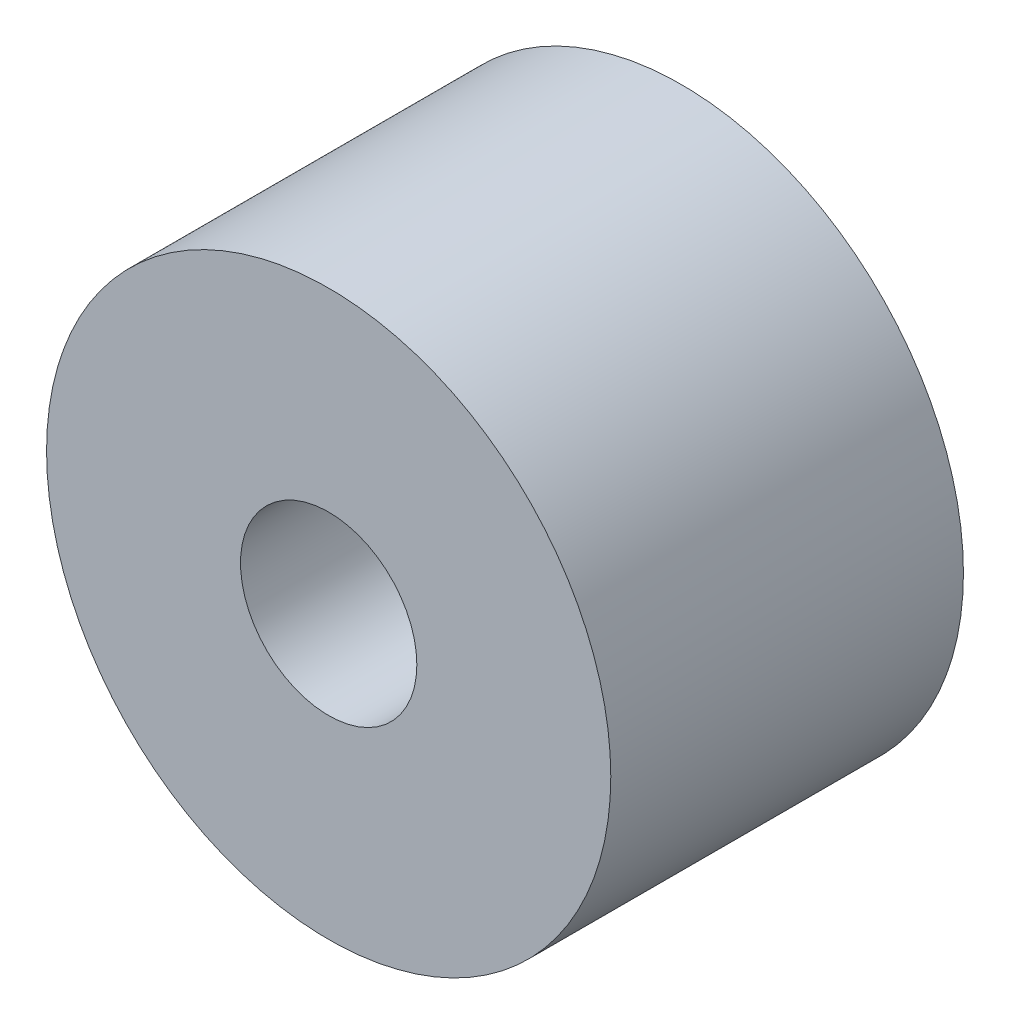
ISO-10303-21;
HEADER;
FILE_DESCRIPTION(('STEP AP214'),'2;1');
FILE_NAME('part.step','',(''),(''),'','','');
FILE_SCHEMA(('AUTOMOTIVE_DESIGN { 1 0 10303 214 1 1 1 1 }'));
ENDSEC;
DATA;
#1=APPLICATION_CONTEXT('core data for automotive mechanical design processes');
#2=APPLICATION_PROTOCOL_DEFINITION('international standard','automotive_design',2000,#1);
#3=PRODUCT_CONTEXT('',#1,'mechanical');
#4=PRODUCT('Part','Part','',(#3));
#5=PRODUCT_RELATED_PRODUCT_CATEGORY('part','',(#4));
#6=PRODUCT_DEFINITION_FORMATION('','',#4);
#7=PRODUCT_DEFINITION_CONTEXT('part definition',#1,'design');
#8=PRODUCT_DEFINITION('design','',#6,#7);
#9=PRODUCT_DEFINITION_SHAPE('','',#8);
#10=(LENGTH_UNIT() NAMED_UNIT(*) SI_UNIT(.MILLI.,.METRE.));
#11=(NAMED_UNIT(*) PLANE_ANGLE_UNIT() SI_UNIT($,.RADIAN.));
#12=(NAMED_UNIT(*) SI_UNIT($,.STERADIAN.) SOLID_ANGLE_UNIT());
#13=UNCERTAINTY_MEASURE_WITH_UNIT(LENGTH_MEASURE(1.E-05),#10,'distance_accuracy_value','');
#14=(GEOMETRIC_REPRESENTATION_CONTEXT(3) GLOBAL_UNCERTAINTY_ASSIGNED_CONTEXT((#13)) GLOBAL_UNIT_ASSIGNED_CONTEXT((#10,
#11,#12)) REPRESENTATION_CONTEXT('',''));
#15=CARTESIAN_POINT('',(0.,0.,0.));
#16=DIRECTION('',(0.,0.,1.));
#17=DIRECTION('',(1.,0.,0.));
#18=AXIS2_PLACEMENT_3D('',#15,#16,#17);
#19=CARTESIAN_POINT('',(0.,0.,6.35));
#20=DIRECTION('',(0.,0.,1.));
#21=DIRECTION('',(1.,0.,0.));
#22=AXIS2_PLACEMENT_3D('',#19,#20,#21);
#23=PLANE('',#22);
#24=CARTESIAN_POINT('',(0.,0.,6.35));
#25=DIRECTION('',(0.,0.,1.));
#26=DIRECTION('',(1.,0.,0.));
#27=AXIS2_PLACEMENT_3D('',#24,#25,#26);
#28=CIRCLE('',#27,5.08);
#29=CARTESIAN_POINT('',(5.08,0.,6.35));
#30=VERTEX_POINT('',#29);
#31=EDGE_CURVE('E10',#30,#30,#28,.T.);
#32=ORIENTED_EDGE('',*,*,#31,.T.);
#33=EDGE_LOOP('',(#32));
#34=FACE_BOUND('',#33,.T.);
#35=CARTESIAN_POINT('',(0.,0.,6.35));
#36=DIRECTION('',(0.,0.,1.));
#37=DIRECTION('',(1.,0.,0.));
#38=AXIS2_PLACEMENT_3D('',#35,#36,#37);
#39=CIRCLE('',#38,1.5875);
#40=CARTESIAN_POINT('',(1.5875,0.,6.35));
#41=VERTEX_POINT('',#40);
#42=EDGE_CURVE('E50',#41,#41,#39,.T.);
#43=ORIENTED_EDGE('',*,*,#42,.F.);
#44=EDGE_LOOP('',(#43));
#45=FACE_BOUND('',#44,.T.);
#46=ADVANCED_FACE('F37',(#34,#45),#23,.T.);
#47=CARTESIAN_POINT('',(0.,0.,0.));
#48=DIRECTION('',(0.,0.,1.));
#49=DIRECTION('',(1.,0.,0.));
#50=AXIS2_PLACEMENT_3D('',#47,#48,#49);
#51=PLANE('',#50);
#52=CARTESIAN_POINT('',(0.,0.,0.));
#53=DIRECTION('',(0.,0.,1.));
#54=DIRECTION('',(1.,0.,0.));
#55=AXIS2_PLACEMENT_3D('',#52,#53,#54);
#56=CIRCLE('',#55,5.08);
#57=CARTESIAN_POINT('',(5.08,0.,0.));
#58=VERTEX_POINT('',#57);
#59=EDGE_CURVE('E41',#58,#58,#56,.T.);
#60=ORIENTED_EDGE('',*,*,#59,.F.);
#61=EDGE_LOOP('',(#60));
#62=FACE_BOUND('',#61,.T.);
#63=CARTESIAN_POINT('',(0.,0.,0.));
#64=DIRECTION('',(0.,0.,1.));
#65=DIRECTION('',(1.,0.,0.));
#66=AXIS2_PLACEMENT_3D('',#63,#64,#65);
#67=CIRCLE('',#66,1.5875);
#68=CARTESIAN_POINT('',(1.5875,0.,0.));
#69=VERTEX_POINT('',#68);
#70=EDGE_CURVE('E52',#69,#69,#67,.T.);
#71=ORIENTED_EDGE('',*,*,#70,.T.);
#72=EDGE_LOOP('',(#71));
#73=FACE_BOUND('',#72,.T.);
#74=ADVANCED_FACE('F64',(#62,#73),#51,.F.);
#75=CARTESIAN_POINT('',(0.,0.,6.35));
#76=DIRECTION('',(0.,0.,-1.));
#77=DIRECTION('',(-1.,0.,0.));
#78=AXIS2_PLACEMENT_3D('',#75,#76,#77);
#79=CYLINDRICAL_SURFACE('',#78,5.08);
#80=ORIENTED_EDGE('',*,*,#31,.F.);
#81=EDGE_LOOP('',(#80));
#82=FACE_BOUND('',#81,.T.);
#83=ORIENTED_EDGE('',*,*,#59,.T.);
#84=EDGE_LOOP('',(#83));
#85=FACE_BOUND('',#84,.T.);
#86=ADVANCED_FACE('F39',(#82,#85),#79,.T.);
#87=CARTESIAN_POINT('',(0.,0.,6.35));
#88=DIRECTION('',(0.,0.,-1.));
#89=DIRECTION('',(-1.,0.,0.));
#90=AXIS2_PLACEMENT_3D('',#87,#88,#89);
#91=CYLINDRICAL_SURFACE('',#90,1.5875);
#92=ORIENTED_EDGE('',*,*,#42,.T.);
#93=EDGE_LOOP('',(#92));
#94=FACE_BOUND('',#93,.T.);
#95=ORIENTED_EDGE('',*,*,#70,.F.);
#96=EDGE_LOOP('',(#95));
#97=FACE_BOUND('',#96,.T.);
#98=ADVANCED_FACE('F60',(#94,#97),#91,.F.);
#99=CLOSED_SHELL('',(#46,#74,#86,#98));
#100=MANIFOLD_SOLID_BREP('B2',#99);
#101=ADVANCED_BREP_SHAPE_REPRESENTATION('',(#18,#100),#14);
#102=SHAPE_DEFINITION_REPRESENTATION(#9,#101);
ENDSEC;
END-ISO-10303-21;
